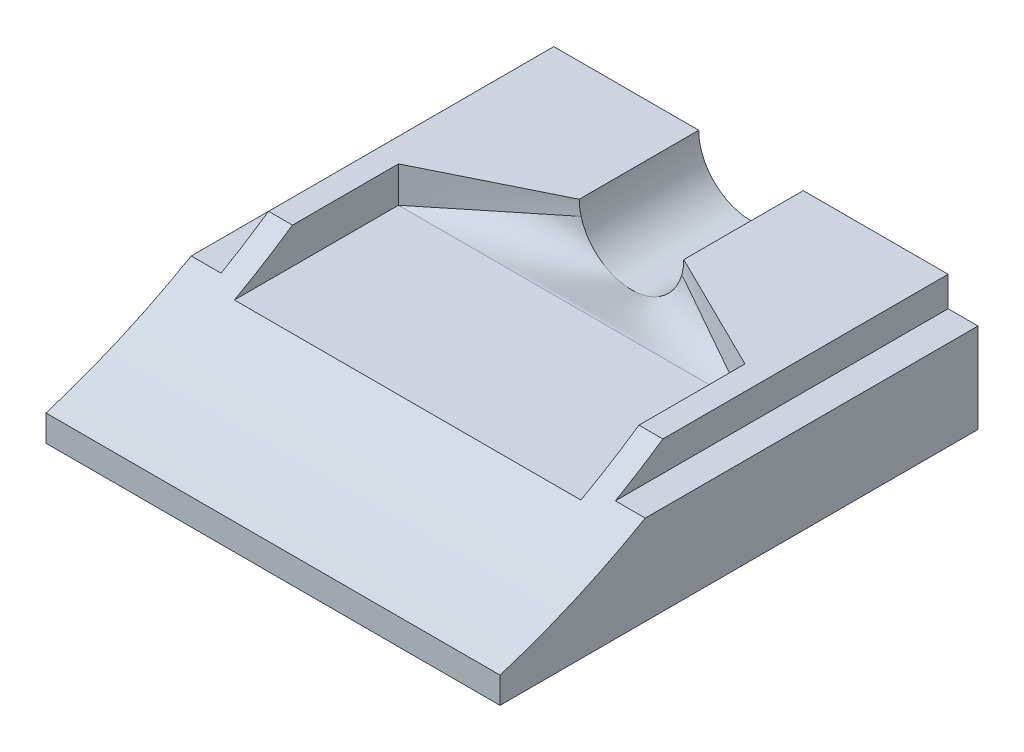
ISO-10303-21;
HEADER;
FILE_DESCRIPTION(('STEP AP214'),'2;1');
FILE_NAME('part.step','',(''),(''),'','','');
FILE_SCHEMA(('AUTOMOTIVE_DESIGN { 1 0 10303 214 1 1 1 1 }'));
ENDSEC;
DATA;
#1=APPLICATION_CONTEXT('core data for automotive mechanical design processes');
#2=APPLICATION_PROTOCOL_DEFINITION('international standard','automotive_design',2000,#1);
#3=PRODUCT_CONTEXT('',#1,'mechanical');
#4=PRODUCT('Part','Part','',(#3));
#5=PRODUCT_RELATED_PRODUCT_CATEGORY('part','',(#4));
#6=PRODUCT_DEFINITION_FORMATION('','',#4);
#7=PRODUCT_DEFINITION_CONTEXT('part definition',#1,'design');
#8=PRODUCT_DEFINITION('design','',#6,#7);
#9=PRODUCT_DEFINITION_SHAPE('','',#8);
#10=(LENGTH_UNIT() NAMED_UNIT(*) SI_UNIT(.MILLI.,.METRE.));
#11=(NAMED_UNIT(*) PLANE_ANGLE_UNIT() SI_UNIT($,.RADIAN.));
#12=(NAMED_UNIT(*) SI_UNIT($,.STERADIAN.) SOLID_ANGLE_UNIT());
#13=UNCERTAINTY_MEASURE_WITH_UNIT(LENGTH_MEASURE(1.E-05),#10,'distance_accuracy_value','');
#14=(GEOMETRIC_REPRESENTATION_CONTEXT(3) GLOBAL_UNCERTAINTY_ASSIGNED_CONTEXT((#13)) GLOBAL_UNIT_ASSIGNED_CONTEXT((#10,
#11,#12)) REPRESENTATION_CONTEXT('',''));
#15=CARTESIAN_POINT('',(0.,0.,0.));
#16=DIRECTION('',(0.,0.,1.));
#17=DIRECTION('',(1.,0.,0.));
#18=AXIS2_PLACEMENT_3D('',#15,#16,#17);
#19=CARTESIAN_POINT('',(-24.13,6.35,50.8));
#20=DIRECTION('',(0.,-1.,0.));
#21=DIRECTION('',(0.,0.,-1.));
#22=AXIS2_PLACEMENT_3D('',#19,#20,#21);
#23=PLANE('',#22);
#24=DIRECTION('',(0.,0.,1.));
#25=VECTOR('',#24,1.);
#26=CARTESIAN_POINT('',(18.415,6.35,19.05));
#27=LINE('',#26,#25);
#28=CARTESIAN_POINT('',(18.415,6.35,19.05));
#29=VERTEX_POINT('',#28);
#30=CARTESIAN_POINT('',(18.415,6.34999999999999,30.3182860225088));
#31=VERTEX_POINT('',#30);
#32=EDGE_CURVE('E292',#29,#31,#27,.T.);
#33=ORIENTED_EDGE('',*,*,#32,.T.);
#34=DIRECTION('',(-1.,0.,0.));
#35=VECTOR('',#34,1.);
#36=CARTESIAN_POINT('',(24.13,6.34999999999999,30.3182860225089));
#37=LINE('',#36,#35);
#38=CARTESIAN_POINT('',(20.955,6.34999999999999,30.3182860225089));
#39=VERTEX_POINT('',#38);
#40=EDGE_CURVE('E350',#31,#39,#37,.F.);
#41=ORIENTED_EDGE('',*,*,#40,.T.);
#42=DIRECTION('',(0.,0.,-1.));
#43=VECTOR('',#42,1.);
#44=CARTESIAN_POINT('',(20.955,6.35,50.8));
#45=LINE('',#44,#43);
#46=CARTESIAN_POINT('',(20.955,6.35,0.));
#47=VERTEX_POINT('',#46);
#48=EDGE_CURVE('E209',#39,#47,#45,.T.);
#49=ORIENTED_EDGE('',*,*,#48,.T.);
#50=DIRECTION('',(-1.,0.,0.));
#51=VECTOR('',#50,1.);
#52=CARTESIAN_POINT('',(-24.13,6.35,0.));
#53=LINE('',#52,#51);
#54=CARTESIAN_POINT('',(5.55625,6.35,0.));
#55=VERTEX_POINT('',#54);
#56=EDGE_CURVE('E228',#47,#55,#53,.T.);
#57=ORIENTED_EDGE('',*,*,#56,.T.);
#58=DIRECTION('',(0.,0.,-1.));
#59=VECTOR('',#58,1.);
#60=CARTESIAN_POINT('',(5.55625,6.35,12.7));
#61=LINE('',#60,#59);
#62=CARTESIAN_POINT('',(5.55625,6.35,12.7));
#63=VERTEX_POINT('',#62);
#64=EDGE_CURVE('E514',#63,#55,#61,.T.);
#65=ORIENTED_EDGE('',*,*,#64,.F.);
#66=CARTESIAN_POINT('',(18.415,6.35,19.05));
#67=CARTESIAN_POINT('',(14.12875,6.35,16.9333333333333));
#68=CARTESIAN_POINT('',(9.8425,6.35,14.8166666666667));
#69=CARTESIAN_POINT('',(5.55625,6.35,12.7));
#70=B_SPLINE_CURVE_WITH_KNOTS('',3,(#66,#67,#68,#69),.UNSPECIFIED.,.F.,.F.,(4,4),(0.,1.),.UNSPECIFIED.);
#71=EDGE_CURVE('E353',#63,#29,#70,.F.);
#72=ORIENTED_EDGE('',*,*,#71,.T.);
#73=EDGE_LOOP('',(#33,#41,#49,#57,#65,#72));
#74=FACE_BOUND('',#73,.T.);
#75=ADVANCED_FACE('F66',(#74),#23,.F.);
#76=DIRECTION('',(0.,0.,-1.));
#77=VECTOR('',#76,1.);
#78=CARTESIAN_POINT('',(-20.955,6.35,50.8));
#79=LINE('',#78,#77);
#80=CARTESIAN_POINT('',(-20.955,6.34999999999999,30.3182860225089));
#81=VERTEX_POINT('',#80);
#82=CARTESIAN_POINT('',(-20.955,6.35,0.));
#83=VERTEX_POINT('',#82);
#84=EDGE_CURVE('E535',#81,#83,#79,.T.);
#85=ORIENTED_EDGE('',*,*,#84,.F.);
#86=DIRECTION('',(-1.,0.,0.));
#87=VECTOR('',#86,1.);
#88=CARTESIAN_POINT('',(24.13,6.34999999999999,30.3182860225089));
#89=LINE('',#88,#87);
#90=CARTESIAN_POINT('',(-18.415,6.34999999999999,30.3182860225088));
#91=VERTEX_POINT('',#90);
#92=EDGE_CURVE('E363',#81,#91,#89,.F.);
#93=ORIENTED_EDGE('',*,*,#92,.T.);
#94=DIRECTION('',(0.,0.,1.));
#95=VECTOR('',#94,1.);
#96=CARTESIAN_POINT('',(-18.415,6.35,19.05));
#97=LINE('',#96,#95);
#98=CARTESIAN_POINT('',(-18.415,6.35,19.05));
#99=VERTEX_POINT('',#98);
#100=EDGE_CURVE('E300',#99,#91,#97,.T.);
#101=ORIENTED_EDGE('',*,*,#100,.F.);
#102=CARTESIAN_POINT('',(-5.55625,6.35,12.7));
#103=CARTESIAN_POINT('',(-9.8425,6.35,14.8166666666667));
#104=CARTESIAN_POINT('',(-14.12875,6.35,16.9333333333333));
#105=CARTESIAN_POINT('',(-18.415,6.35,19.05));
#106=B_SPLINE_CURVE_WITH_KNOTS('',3,(#102,#103,#104,#105),.UNSPECIFIED.,.F.,.F.,(4,4),(0.,1.),.UNSPECIFIED.);
#107=CARTESIAN_POINT('',(-5.55625,6.35,12.7));
#108=VERTEX_POINT('',#107);
#109=EDGE_CURVE('E474',#108,#99,#106,.T.);
#110=ORIENTED_EDGE('',*,*,#109,.F.);
#111=DIRECTION('',(0.,0.,-1.));
#112=VECTOR('',#111,1.);
#113=CARTESIAN_POINT('',(-5.55625,6.35,12.7));
#114=LINE('',#113,#112);
#115=CARTESIAN_POINT('',(-5.55625,6.35,0.));
#116=VERTEX_POINT('',#115);
#117=EDGE_CURVE('E227',#116,#108,#114,.F.);
#118=ORIENTED_EDGE('',*,*,#117,.F.);
#119=EDGE_CURVE('E226',#116,#83,#53,.T.);
#120=ORIENTED_EDGE('',*,*,#119,.T.);
#121=EDGE_LOOP('',(#85,#93,#101,#110,#118,#120));
#122=FACE_BOUND('',#121,.T.);
#123=ADVANCED_FACE('F270',(#122),#23,.F.);
#124=CARTESIAN_POINT('',(0.,0.,0.));
#125=DIRECTION('',(0.,0.,1.));
#126=DIRECTION('',(1.,0.,0.));
#127=AXIS2_PLACEMENT_3D('',#124,#125,#126);
#128=PLANE('',#127);
#129=DIRECTION('',(-1.,0.,0.));
#130=VECTOR('',#129,1.);
#131=CARTESIAN_POINT('',(-20.955,3.175,0.));
#132=LINE('',#131,#130);
#133=CARTESIAN_POINT('',(-20.955,3.175,0.));
#134=VERTEX_POINT('',#133);
#135=CARTESIAN_POINT('',(-24.13,3.175,0.));
#136=VERTEX_POINT('',#135);
#137=EDGE_CURVE('E540',#134,#136,#132,.T.);
#138=ORIENTED_EDGE('',*,*,#137,.F.);
#139=DIRECTION('',(0.,-1.,0.));
#140=VECTOR('',#139,1.);
#141=CARTESIAN_POINT('',(-20.955,6.35,0.));
#142=LINE('',#141,#140);
#143=EDGE_CURVE('E534',#83,#134,#142,.T.);
#144=ORIENTED_EDGE('',*,*,#143,.F.);
#145=ORIENTED_EDGE('',*,*,#119,.F.);
#146=CARTESIAN_POINT('',(0.,6.35,0.));
#147=DIRECTION('',(0.,0.,1.));
#148=DIRECTION('',(1.,0.,0.));
#149=AXIS2_PLACEMENT_3D('',#146,#147,#148);
#150=CIRCLE('',#149,5.55625);
#151=EDGE_CURVE('E74',#55,#116,#150,.F.);
#152=ORIENTED_EDGE('',*,*,#151,.F.);
#153=ORIENTED_EDGE('',*,*,#56,.F.);
#154=DIRECTION('',(0.,-1.,0.));
#155=VECTOR('',#154,1.);
#156=CARTESIAN_POINT('',(20.955,6.35,0.));
#157=LINE('',#156,#155);
#158=CARTESIAN_POINT('',(20.955,3.175,0.));
#159=VERTEX_POINT('',#158);
#160=EDGE_CURVE('E531',#47,#159,#157,.T.);
#161=ORIENTED_EDGE('',*,*,#160,.T.);
#162=DIRECTION('',(1.,0.,0.));
#163=VECTOR('',#162,1.);
#164=CARTESIAN_POINT('',(20.955,3.175,0.));
#165=LINE('',#164,#163);
#166=CARTESIAN_POINT('',(24.13,3.175,0.));
#167=VERTEX_POINT('',#166);
#168=EDGE_CURVE('E213',#159,#167,#165,.T.);
#169=ORIENTED_EDGE('',*,*,#168,.T.);
#170=DIRECTION('',(0.,1.,0.));
#171=VECTOR('',#170,1.);
#172=CARTESIAN_POINT('',(24.13,6.35,0.));
#173=LINE('',#172,#171);
#174=CARTESIAN_POINT('',(24.13,-6.35,0.));
#175=VERTEX_POINT('',#174);
#176=EDGE_CURVE('E208',#175,#167,#173,.T.);
#177=ORIENTED_EDGE('',*,*,#176,.F.);
#178=DIRECTION('',(1.,0.,0.));
#179=VECTOR('',#178,1.);
#180=CARTESIAN_POINT('',(-24.13,-6.35,0.));
#181=LINE('',#180,#179);
#182=CARTESIAN_POINT('',(-24.13,-6.35,0.));
#183=VERTEX_POINT('',#182);
#184=EDGE_CURVE('E220',#183,#175,#181,.T.);
#185=ORIENTED_EDGE('',*,*,#184,.F.);
#186=DIRECTION('',(0.,-1.,0.));
#187=VECTOR('',#186,1.);
#188=CARTESIAN_POINT('',(-24.13,6.35,0.));
#189=LINE('',#188,#187);
#190=EDGE_CURVE('E230',#136,#183,#189,.T.);
#191=ORIENTED_EDGE('',*,*,#190,.F.);
#192=EDGE_LOOP('',(#138,#144,#145,#152,#153,#161,#169,#177,#185,#191));
#193=FACE_BOUND('',#192,.T.);
#194=ADVANCED_FACE('F267',(#193),#128,.F.);
#195=CARTESIAN_POINT('',(24.13,6.35,50.8));
#196=DIRECTION('',(-1.,0.,0.));
#197=DIRECTION('',(0.,0.,1.));
#198=AXIS2_PLACEMENT_3D('',#195,#196,#197);
#199=PLANE('',#198);
#200=DIRECTION('',(0.,0.,-1.));
#201=VECTOR('',#200,1.);
#202=CARTESIAN_POINT('',(24.13,3.175,50.8));
#203=LINE('',#202,#201);
#204=CARTESIAN_POINT('',(24.13,3.175,35.366160829178));
#205=VERTEX_POINT('',#204);
#206=EDGE_CURVE('E200',#205,#167,#203,.T.);
#207=ORIENTED_EDGE('',*,*,#206,.F.);
#208=CARTESIAN_POINT('',(24.13,69.2150000000001,73.3813998788012));
#209=DIRECTION('',(-1.,0.,0.));
#210=DIRECTION('',(0.,0.,1.));
#211=AXIS2_PLACEMENT_3D('',#208,#209,#210);
#212=CIRCLE('',#211,76.2000000000001);
#213=CARTESIAN_POINT('',(24.13,-3.56219683742755,50.8));
#214=VERTEX_POINT('',#213);
#215=EDGE_CURVE('E183',#205,#214,#212,.T.);
#216=ORIENTED_EDGE('',*,*,#215,.T.);
#217=DIRECTION('',(0.,1.,0.));
#218=VECTOR('',#217,1.);
#219=CARTESIAN_POINT('',(24.13,6.35,50.8));
#220=LINE('',#219,#218);
#221=CARTESIAN_POINT('',(24.13,-6.35,50.8));
#222=VERTEX_POINT('',#221);
#223=EDGE_CURVE('E217',#222,#214,#220,.T.);
#224=ORIENTED_EDGE('',*,*,#223,.F.);
#225=DIRECTION('',(0.,0.,-1.));
#226=VECTOR('',#225,1.);
#227=CARTESIAN_POINT('',(24.13,-6.35,50.8));
#228=LINE('',#227,#226);
#229=EDGE_CURVE('E224',#222,#175,#228,.T.);
#230=ORIENTED_EDGE('',*,*,#229,.T.);
#231=ORIENTED_EDGE('',*,*,#176,.T.);
#232=EDGE_LOOP('',(#207,#216,#224,#230,#231));
#233=FACE_BOUND('',#232,.T.);
#234=ADVANCED_FACE('F68',(#233),#199,.F.);
#235=CARTESIAN_POINT('',(0.,0.,50.8));
#236=DIRECTION('',(0.,0.,1.));
#237=DIRECTION('',(1.,0.,0.));
#238=AXIS2_PLACEMENT_3D('',#235,#236,#237);
#239=PLANE('',#238);
#240=DIRECTION('',(-1.,0.,0.));
#241=VECTOR('',#240,1.);
#242=CARTESIAN_POINT('',(24.13,-3.56219683742753,50.8));
#243=LINE('',#242,#241);
#244=CARTESIAN_POINT('',(-24.13,-3.56219683742755,50.8));
#245=VERTEX_POINT('',#244);
#246=EDGE_CURVE('E189',#245,#214,#243,.F.);
#247=ORIENTED_EDGE('',*,*,#246,.F.);
#248=DIRECTION('',(0.,-1.,0.));
#249=VECTOR('',#248,1.);
#250=CARTESIAN_POINT('',(-24.13,6.35,50.8));
#251=LINE('',#250,#249);
#252=CARTESIAN_POINT('',(-24.13,-6.35,50.8));
#253=VERTEX_POINT('',#252);
#254=EDGE_CURVE('E219',#245,#253,#251,.T.);
#255=ORIENTED_EDGE('',*,*,#254,.T.);
#256=DIRECTION('',(1.,0.,0.));
#257=VECTOR('',#256,1.);
#258=CARTESIAN_POINT('',(-24.13,-6.35,50.8));
#259=LINE('',#258,#257);
#260=EDGE_CURVE('E222',#253,#222,#259,.T.);
#261=ORIENTED_EDGE('',*,*,#260,.T.);
#262=ORIENTED_EDGE('',*,*,#223,.T.);
#263=EDGE_LOOP('',(#247,#255,#261,#262));
#264=FACE_BOUND('',#263,.T.);
#265=ADVANCED_FACE('F262',(#264),#239,.T.);
#266=CARTESIAN_POINT('',(-24.13,6.35,50.8));
#267=DIRECTION('',(1.,0.,0.));
#268=DIRECTION('',(0.,0.,-1.));
#269=AXIS2_PLACEMENT_3D('',#266,#267,#268);
#270=PLANE('',#269);
#271=ORIENTED_EDGE('',*,*,#254,.F.);
#272=CARTESIAN_POINT('',(-24.13,69.2150000000001,73.3813998788012));
#273=DIRECTION('',(-1.,0.,0.));
#274=DIRECTION('',(0.,0.,1.));
#275=AXIS2_PLACEMENT_3D('',#272,#273,#274);
#276=CIRCLE('',#275,76.2000000000001);
#277=CARTESIAN_POINT('',(-24.13,3.175,35.366160829178));
#278=VERTEX_POINT('',#277);
#279=EDGE_CURVE('E194',#278,#245,#276,.T.);
#280=ORIENTED_EDGE('',*,*,#279,.F.);
#281=DIRECTION('',(0.,0.,-1.));
#282=VECTOR('',#281,1.);
#283=CARTESIAN_POINT('',(-24.13,3.175,50.8));
#284=LINE('',#283,#282);
#285=EDGE_CURVE('E88',#278,#136,#284,.T.);
#286=ORIENTED_EDGE('',*,*,#285,.T.);
#287=ORIENTED_EDGE('',*,*,#190,.T.);
#288=DIRECTION('',(0.,0.,-1.));
#289=VECTOR('',#288,1.);
#290=CARTESIAN_POINT('',(-24.13,-6.35,50.8));
#291=LINE('',#290,#289);
#292=EDGE_CURVE('E234',#253,#183,#291,.T.);
#293=ORIENTED_EDGE('',*,*,#292,.F.);
#294=EDGE_LOOP('',(#271,#280,#286,#287,#293));
#295=FACE_BOUND('',#294,.T.);
#296=ADVANCED_FACE('F265',(#295),#270,.F.);
#297=CARTESIAN_POINT('',(-24.13,-6.35,50.8));
#298=DIRECTION('',(0.,1.,0.));
#299=DIRECTION('',(0.,0.,1.));
#300=AXIS2_PLACEMENT_3D('',#297,#298,#299);
#301=PLANE('',#300);
#302=ORIENTED_EDGE('',*,*,#184,.T.);
#303=ORIENTED_EDGE('',*,*,#229,.F.);
#304=ORIENTED_EDGE('',*,*,#260,.F.);
#305=ORIENTED_EDGE('',*,*,#292,.T.);
#306=EDGE_LOOP('',(#302,#303,#304,#305));
#307=FACE_BOUND('',#306,.T.);
#308=ADVANCED_FACE('F260',(#307),#301,.F.);
#309=CARTESIAN_POINT('',(0.,6.35,12.7));
#310=DIRECTION('',(0.,0.,-1.));
#311=DIRECTION('',(-1.,0.,0.));
#312=AXIS2_PLACEMENT_3D('',#309,#310,#311);
#313=CYLINDRICAL_SURFACE('',#312,5.55625);
#314=ORIENTED_EDGE('',*,*,#117,.T.);
#315=CARTESIAN_POINT('',(-5.35601864474133,4.87183277682016,12.7));
#316=CARTESIAN_POINT('',(-5.37260366410709,4.93192729785584,12.7));
#317=CARTESIAN_POINT('',(-5.38817695319483,4.99230104112544,12.7));
#318=CARTESIAN_POINT('',(-5.41728349727584,5.11353822285822,12.7));
#319=CARTESIAN_POINT('',(-5.43081675463902,5.17440166075243,12.7));
#320=CARTESIAN_POINT('',(-5.45582661896698,5.29654922496364,12.7));
#321=CARTESIAN_POINT('',(-5.46730323931493,5.35783334854042,12.7));
#322=CARTESIAN_POINT('',(-5.48818810175741,5.48075299722203,12.7));
#323=CARTESIAN_POINT('',(-5.49759634479022,5.54238852216744,12.7));
#324=CARTESIAN_POINT('',(-5.51433277590191,5.66594171631692,12.7));
#325=CARTESIAN_POINT('',(-5.52166095135057,5.72785938723186,12.7));
#326=CARTESIAN_POINT('',(-5.5342300271045,5.85190643782034,12.7));
#327=CARTESIAN_POINT('',(-5.53947092028074,5.91403581821624,12.7));
#328=CARTESIAN_POINT('',(-5.54785817638951,6.03843575338189,12.7));
#329=CARTESIAN_POINT('',(-5.55100454073027,6.10070630805671,12.7));
#330=CARTESIAN_POINT('',(-5.55520045054686,6.22531790980704,12.7));
#331=CARTESIAN_POINT('',(-5.55624999978628,6.28765895675583,12.7));
#332=CARTESIAN_POINT('',(-5.55625,6.35,12.7));
#333=B_SPLINE_CURVE_WITH_KNOTS('',3,(#315,#316,#317,#318,#319,#320,#321,#322,#323,#324,#325,
#326,#327,#328,#329,#330,#331,#332),.UNSPECIFIED.,.F.,.F.,(4,2,2,2,2,2,2,2,4),(0.,
0.187014529944674,0.374028842630938,0.561041938313546,0.748054949161111,0.935069095531518,
1.12208388063585,1.30909854000274,1.49611286369624),.UNSPECIFIED.);
#334=CARTESIAN_POINT('',(-5.35639345933783,4.87172840631147,12.7));
#335=VERTEX_POINT('',#334);
#336=EDGE_CURVE('E211',#108,#335,#333,.F.);
#337=ORIENTED_EDGE('',*,*,#336,.T.);
#338=CARTESIAN_POINT('',(0.,6.35,12.7));
#339=DIRECTION('',(0.,0.,1.));
#340=DIRECTION('',(1.,0.,0.));
#341=AXIS2_PLACEMENT_3D('',#338,#339,#340);
#342=CIRCLE('',#341,5.55625);
#343=CARTESIAN_POINT('',(5.35635033199778,4.87174042441235,12.7));
#344=VERTEX_POINT('',#343);
#345=EDGE_CURVE('E383',#335,#344,#342,.T.);
#346=ORIENTED_EDGE('',*,*,#345,.T.);
#347=EDGE_CURVE('E385',#344,#63,#342,.T.);
#348=ORIENTED_EDGE('',*,*,#347,.T.);
#349=ORIENTED_EDGE('',*,*,#64,.T.);
#350=ORIENTED_EDGE('',*,*,#151,.T.);
#351=EDGE_LOOP('',(#314,#337,#346,#348,#349,#350));
#352=FACE_BOUND('',#351,.T.);
#353=ADVANCED_FACE('F249',(#352),#313,.F.);
#354=CARTESIAN_POINT('',(20.955,6.35,50.8));
#355=DIRECTION('',(1.,0.,0.));
#356=DIRECTION('',(0.,0.,-1.));
#357=AXIS2_PLACEMENT_3D('',#354,#355,#356);
#358=PLANE('',#357);
#359=CARTESIAN_POINT('',(20.955,69.2150000000001,73.3813998788012));
#360=DIRECTION('',(1.,0.,0.));
#361=DIRECTION('',(0.,0.,-1.));
#362=AXIS2_PLACEMENT_3D('',#359,#360,#361);
#363=CIRCLE('',#362,76.2000000000001);
#364=CARTESIAN_POINT('',(20.955,3.175,35.366160829178));
#365=VERTEX_POINT('',#364);
#366=EDGE_CURVE('E373',#365,#39,#363,.T.);
#367=ORIENTED_EDGE('',*,*,#366,.F.);
#368=DIRECTION('',(0.,0.,-1.));
#369=VECTOR('',#368,1.);
#370=CARTESIAN_POINT('',(20.955,3.175,50.8));
#371=LINE('',#370,#369);
#372=EDGE_CURVE('E202',#365,#159,#371,.T.);
#373=ORIENTED_EDGE('',*,*,#372,.T.);
#374=ORIENTED_EDGE('',*,*,#160,.F.);
#375=ORIENTED_EDGE('',*,*,#48,.F.);
#376=EDGE_LOOP('',(#367,#373,#374,#375));
#377=FACE_BOUND('',#376,.T.);
#378=ADVANCED_FACE('F259',(#377),#358,.T.);
#379=CARTESIAN_POINT('',(20.955,3.175,50.8));
#380=DIRECTION('',(0.,1.,0.));
#381=DIRECTION('',(0.,0.,1.));
#382=AXIS2_PLACEMENT_3D('',#379,#380,#381);
#383=PLANE('',#382);
#384=DIRECTION('',(-1.,0.,0.));
#385=VECTOR('',#384,1.);
#386=CARTESIAN_POINT('',(24.13,3.175,35.366160829178));
#387=LINE('',#386,#385);
#388=EDGE_CURVE('E186',#205,#365,#387,.T.);
#389=ORIENTED_EDGE('',*,*,#388,.F.);
#390=ORIENTED_EDGE('',*,*,#206,.T.);
#391=ORIENTED_EDGE('',*,*,#168,.F.);
#392=ORIENTED_EDGE('',*,*,#372,.F.);
#393=EDGE_LOOP('',(#389,#390,#391,#392));
#394=FACE_BOUND('',#393,.T.);
#395=ADVANCED_FACE('F198',(#394),#383,.T.);
#396=CARTESIAN_POINT('',(-20.955,6.35,50.8));
#397=DIRECTION('',(1.,0.,0.));
#398=DIRECTION('',(0.,0.,-1.));
#399=AXIS2_PLACEMENT_3D('',#396,#397,#398);
#400=PLANE('',#399);
#401=DIRECTION('',(0.,0.,-1.));
#402=VECTOR('',#401,1.);
#403=CARTESIAN_POINT('',(-20.955,3.175,50.8));
#404=LINE('',#403,#402);
#405=CARTESIAN_POINT('',(-20.955,3.175,35.366160829178));
#406=VERTEX_POINT('',#405);
#407=EDGE_CURVE('E537',#406,#134,#404,.T.);
#408=ORIENTED_EDGE('',*,*,#407,.F.);
#409=CARTESIAN_POINT('',(-20.955,69.2150000000001,73.3813998788012));
#410=DIRECTION('',(1.,0.,0.));
#411=DIRECTION('',(0.,0.,-1.));
#412=AXIS2_PLACEMENT_3D('',#409,#410,#411);
#413=CIRCLE('',#412,76.2000000000001);
#414=EDGE_CURVE('E370',#406,#81,#413,.T.);
#415=ORIENTED_EDGE('',*,*,#414,.T.);
#416=ORIENTED_EDGE('',*,*,#84,.T.);
#417=ORIENTED_EDGE('',*,*,#143,.T.);
#418=EDGE_LOOP('',(#408,#415,#416,#417));
#419=FACE_BOUND('',#418,.T.);
#420=ADVANCED_FACE('F333',(#419),#400,.F.);
#421=CARTESIAN_POINT('',(-20.955,3.175,50.8));
#422=DIRECTION('',(0.,-1.,0.));
#423=DIRECTION('',(0.,0.,-1.));
#424=AXIS2_PLACEMENT_3D('',#421,#422,#423);
#425=PLANE('',#424);
#426=ORIENTED_EDGE('',*,*,#285,.F.);
#427=DIRECTION('',(-1.,0.,0.));
#428=VECTOR('',#427,1.);
#429=CARTESIAN_POINT('',(24.13,3.175,35.366160829178));
#430=LINE('',#429,#428);
#431=EDGE_CURVE('E203',#278,#406,#430,.F.);
#432=ORIENTED_EDGE('',*,*,#431,.T.);
#433=ORIENTED_EDGE('',*,*,#407,.T.);
#434=ORIENTED_EDGE('',*,*,#137,.T.);
#435=EDGE_LOOP('',(#426,#432,#433,#434));
#436=FACE_BOUND('',#435,.T.);
#437=ADVANCED_FACE('F329',(#436),#425,.F.);
#438=CARTESIAN_POINT('',(-18.415,6.35,19.05));
#439=DIRECTION('',(-1.,0.,0.));
#440=DIRECTION('',(0.,-1.,0.));
#441=AXIS2_PLACEMENT_3D('',#438,#439,#440);
#442=PLANE('',#441);
#443=ORIENTED_EDGE('',*,*,#100,.T.);
#444=CARTESIAN_POINT('',(-18.4150000000001,69.2150000000001,73.3813998788012));
#445=DIRECTION('',(-1.,0.,0.));
#446=DIRECTION('',(0.,-1.,0.));
#447=AXIS2_PLACEMENT_3D('',#444,#445,#446);
#448=CIRCLE('',#447,76.2000000000001);
#449=CARTESIAN_POINT('',(-18.415,2.54,36.4912335061756));
#450=VERTEX_POINT('',#449);
#451=EDGE_CURVE('E360',#91,#450,#448,.T.);
#452=ORIENTED_EDGE('',*,*,#451,.T.);
#453=DIRECTION('',(0.,0.,1.));
#454=VECTOR('',#453,1.);
#455=CARTESIAN_POINT('',(-18.415,2.54,19.05));
#456=LINE('',#455,#454);
#457=CARTESIAN_POINT('',(-18.415,2.54,19.05));
#458=VERTEX_POINT('',#457);
#459=EDGE_CURVE('E316',#458,#450,#456,.T.);
#460=ORIENTED_EDGE('',*,*,#459,.F.);
#461=CARTESIAN_POINT('',(-18.415,6.35,19.05));
#462=CARTESIAN_POINT('',(-18.415,6.0325,19.05));
#463=CARTESIAN_POINT('',(-18.415,5.3975,19.05));
#464=CARTESIAN_POINT('',(-18.415,4.445,19.05));
#465=CARTESIAN_POINT('',(-18.415,3.4925,19.05));
#466=CARTESIAN_POINT('',(-18.415,2.8575,19.05));
#467=CARTESIAN_POINT('',(-18.415,2.54,19.05));
#468=B_SPLINE_CURVE_WITH_KNOTS('',3,(#461,#462,#463,#464,#465,#466,#467),.UNSPECIFIED.,.F.,.F.,
(4,1,1,1,4),(0.,0.0214285714285714,0.0428571428571429,0.0642857142857143,0.0857142857142857),.UNSPECIFIED.);
#469=EDGE_CURVE('E310',#99,#458,#468,.T.);
#470=ORIENTED_EDGE('',*,*,#469,.F.);
#471=EDGE_LOOP('',(#443,#452,#460,#470));
#472=FACE_BOUND('',#471,.T.);
#473=ADVANCED_FACE('F318',(#472),#442,.F.);
#474=CARTESIAN_POINT('',(18.415,2.54,19.05));
#475=DIRECTION('',(1.,0.,0.));
#476=DIRECTION('',(0.,1.,0.));
#477=AXIS2_PLACEMENT_3D('',#474,#475,#476);
#478=PLANE('',#477);
#479=DIRECTION('',(0.,0.,1.));
#480=VECTOR('',#479,1.);
#481=CARTESIAN_POINT('',(18.415,2.54,19.05));
#482=LINE('',#481,#480);
#483=CARTESIAN_POINT('',(18.415,2.54,19.05));
#484=VERTEX_POINT('',#483);
#485=CARTESIAN_POINT('',(18.415,2.54,36.4912335061756));
#486=VERTEX_POINT('',#485);
#487=EDGE_CURVE('E301',#484,#486,#482,.T.);
#488=ORIENTED_EDGE('',*,*,#487,.T.);
#489=CARTESIAN_POINT('',(18.4150000000001,69.2150000000001,73.3813998788012));
#490=DIRECTION('',(1.,0.,0.));
#491=DIRECTION('',(0.,1.,0.));
#492=AXIS2_PLACEMENT_3D('',#489,#490,#491);
#493=CIRCLE('',#492,76.2000000000001);
#494=EDGE_CURVE('E81',#486,#31,#493,.T.);
#495=ORIENTED_EDGE('',*,*,#494,.T.);
#496=ORIENTED_EDGE('',*,*,#32,.F.);
#497=CARTESIAN_POINT('',(18.415,2.54,19.05));
#498=CARTESIAN_POINT('',(18.415,2.8575,19.05));
#499=CARTESIAN_POINT('',(18.415,3.49249999999999,19.05));
#500=CARTESIAN_POINT('',(18.415,4.44500000000001,19.05));
#501=CARTESIAN_POINT('',(18.415,5.39749999999999,19.05));
#502=CARTESIAN_POINT('',(18.415,6.0325,19.05));
#503=CARTESIAN_POINT('',(18.415,6.35,19.05));
#504=B_SPLINE_CURVE_WITH_KNOTS('',3,(#497,#498,#499,#500,#501,#502,#503),.UNSPECIFIED.,.F.,.F.,
(4,1,1,1,4),(0.914285714285714,0.935714285714286,0.957142857142857,0.978571428571429,1.),.UNSPECIFIED.);
#505=EDGE_CURVE('E357',#484,#29,#504,.T.);
#506=ORIENTED_EDGE('',*,*,#505,.F.);
#507=EDGE_LOOP('',(#488,#495,#496,#506));
#508=FACE_BOUND('',#507,.T.);
#509=ADVANCED_FACE('F328',(#508),#478,.F.);
#510=CARTESIAN_POINT('',(-18.415,2.54,19.05));
#511=DIRECTION('',(0.,-1.,0.));
#512=DIRECTION('',(0.,0.,-1.));
#513=AXIS2_PLACEMENT_3D('',#510,#511,#512);
#514=PLANE('',#513);
#515=ORIENTED_EDGE('',*,*,#459,.T.);
#516=DIRECTION('',(-1.,0.,0.));
#517=VECTOR('',#516,1.);
#518=CARTESIAN_POINT('',(24.13,2.54,36.4912335061756));
#519=LINE('',#518,#517);
#520=EDGE_CURVE('E13',#450,#486,#519,.F.);
#521=ORIENTED_EDGE('',*,*,#520,.T.);
#522=ORIENTED_EDGE('',*,*,#487,.F.);
#523=CARTESIAN_POINT('',(-18.415,2.54,19.05));
#524=CARTESIAN_POINT('',(-16.8804166666667,2.54,19.05));
#525=CARTESIAN_POINT('',(-13.81125,2.54,19.05));
#526=CARTESIAN_POINT('',(-9.2075,2.54,19.05));
#527=CARTESIAN_POINT('',(-4.60375,2.54,19.05));
#528=CARTESIAN_POINT('',(0.,2.54,19.05));
#529=CARTESIAN_POINT('',(4.60375,2.54,19.05));
#530=CARTESIAN_POINT('',(9.2075,2.54,19.05));
#531=CARTESIAN_POINT('',(13.81125,2.54,19.05));
#532=CARTESIAN_POINT('',(16.8804166666667,2.54,19.05));
#533=CARTESIAN_POINT('',(18.415,2.54,19.05));
#534=B_SPLINE_CURVE_WITH_KNOTS('',3,(#523,#524,#525,#526,#527,#528,#529,#530,#531,#532,#533),
.UNSPECIFIED.,.F.,.F.,(4,1,1,1,1,1,1,1,4),(0.0857142857142857,0.189285714285714,
0.292857142857143,0.396428571428572,0.5,0.603571428571429,0.707142857142857,0.810714285714286,
0.914285714285714),.UNSPECIFIED.);
#535=CARTESIAN_POINT('',(11.5341450872156,2.54,19.05));
#536=VERTEX_POINT('',#535);
#537=EDGE_CURVE('E556',#536,#484,#534,.T.);
#538=ORIENTED_EDGE('',*,*,#537,.F.);
#539=CARTESIAN_POINT('',(-18.415,2.54,19.05));
#540=CARTESIAN_POINT('',(-16.8804166666667,2.54,19.05));
#541=CARTESIAN_POINT('',(-13.81125,2.54,19.05));
#542=CARTESIAN_POINT('',(-9.2075,2.54,19.05));
#543=CARTESIAN_POINT('',(-4.60375,2.54,19.05));
#544=CARTESIAN_POINT('',(0.,2.54,19.05));
#545=CARTESIAN_POINT('',(4.60375,2.54,19.05));
#546=CARTESIAN_POINT('',(9.2075,2.54,19.05));
#547=CARTESIAN_POINT('',(13.81125,2.54,19.05));
#548=CARTESIAN_POINT('',(16.8804166666667,2.54,19.05));
#549=CARTESIAN_POINT('',(18.415,2.54,19.05));
#550=B_SPLINE_CURVE_WITH_KNOTS('',3,(#539,#540,#541,#542,#543,#544,#545,#546,#547,#548,#549),
.UNSPECIFIED.,.F.,.F.,(4,1,1,1,1,1,1,1,4),(0.0857142857142857,0.189285714285714,
0.292857142857143,0.396428571428572,0.5,0.603571428571429,0.707142857142857,0.810714285714286,
0.914285714285714),.UNSPECIFIED.);
#551=CARTESIAN_POINT('',(-11.5341450872156,2.54,19.05));
#552=VERTEX_POINT('',#551);
#553=EDGE_CURVE('E458',#552,#536,#550,.T.);
#554=ORIENTED_EDGE('',*,*,#553,.F.);
#555=CARTESIAN_POINT('',(-18.415,2.54,19.05));
#556=CARTESIAN_POINT('',(-16.8804166666667,2.54,19.05));
#557=CARTESIAN_POINT('',(-13.81125,2.54,19.05));
#558=CARTESIAN_POINT('',(-9.2075,2.54,19.05));
#559=CARTESIAN_POINT('',(-4.60375,2.54,19.05));
#560=CARTESIAN_POINT('',(0.,2.54,19.05));
#561=CARTESIAN_POINT('',(4.60375,2.54,19.05));
#562=CARTESIAN_POINT('',(9.2075,2.54,19.05));
#563=CARTESIAN_POINT('',(13.81125,2.54,19.05));
#564=CARTESIAN_POINT('',(16.8804166666667,2.54,19.05));
#565=CARTESIAN_POINT('',(18.415,2.54,19.05));
#566=B_SPLINE_CURVE_WITH_KNOTS('',3,(#555,#556,#557,#558,#559,#560,#561,#562,#563,#564,#565),
.UNSPECIFIED.,.F.,.F.,(4,1,1,1,1,1,1,1,4),(0.0857142857142857,0.189285714285714,
0.292857142857143,0.396428571428572,0.5,0.603571428571429,0.707142857142857,0.810714285714286,
0.914285714285714),.UNSPECIFIED.);
#567=EDGE_CURVE('E553',#458,#552,#566,.T.);
#568=ORIENTED_EDGE('',*,*,#567,.F.);
#569=EDGE_LOOP('',(#515,#521,#522,#538,#554,#568));
#570=FACE_BOUND('',#569,.T.);
#571=ADVANCED_FACE('F330',(#570),#514,.F.);
#572=CARTESIAN_POINT('',(5.35601864474134,4.87183277682016,12.7));
#573=CARTESIAN_POINT('',(9.70901242982756,4.09455518454677,14.8166666666667));
#574=CARTESIAN_POINT('',(14.0620062149138,3.31727759227339,16.9333333333333));
#575=CARTESIAN_POINT('',(18.415,2.54,19.05));
#576=CARTESIAN_POINT('',(5.38918863957491,4.9920215538331,12.7));
#577=CARTESIAN_POINT('',(9.73112575971661,4.28051436922206,14.8166666666667));
#578=CARTESIAN_POINT('',(14.0730628798583,3.56900718461103,16.9333333333333));
#579=CARTESIAN_POINT('',(18.415,2.8575,19.05));
#580=CARTESIAN_POINT('',(5.44743498444064,5.23463341009776,12.7));
#581=CARTESIAN_POINT('',(9.76995665629376,4.6539222733985,14.8166666666667));
#582=CARTESIAN_POINT('',(14.0924783281469,4.07321113669925,16.9333333333333));
#583=CARTESIAN_POINT('',(18.415,3.49249999999999,19.05));
#584=CARTESIAN_POINT('',(5.51012530557085,5.60360536168845,12.7));
#585=CARTESIAN_POINT('',(9.81175020371391,5.21740357445897,14.8166666666667));
#586=CARTESIAN_POINT('',(14.113375101857,4.83120178722949,16.9333333333333));
#587=CARTESIAN_POINT('',(18.415,4.44500000000001,19.05));
#588=CARTESIAN_POINT('',(5.54785339053752,5.97595235940166,12.7));
#589=CARTESIAN_POINT('',(9.83690226035834,5.78313490626777,14.8166666666667));
#590=CARTESIAN_POINT('',(14.1259511301792,5.59031745313388,16.9333333333333));
#591=CARTESIAN_POINT('',(18.415,5.39749999999999,19.05));
#592=CARTESIAN_POINT('',(5.55625,6.22531804189409,12.7));
#593=CARTESIAN_POINT('',(9.8425,6.16104536126273,14.8166666666667));
#594=CARTESIAN_POINT('',(14.12875,6.09677268063136,16.9333333333333));
#595=CARTESIAN_POINT('',(18.415,6.0325,19.05));
#596=CARTESIAN_POINT('',(5.55625,6.35,12.7));
#597=CARTESIAN_POINT('',(9.8425,6.35,14.8166666666667));
#598=CARTESIAN_POINT('',(14.12875,6.35,16.9333333333333));
#599=CARTESIAN_POINT('',(18.415,6.35,19.05));
#600=B_SPLINE_SURFACE_WITH_KNOTS('',3,3,((#572,#573,#574,#575),(#576,#577,#578,#579),(#580,#581,
#582,#583),(#584,#585,#586,#587),(#588,#589,#590,#591),(#592,#593,#594,#595),(#596,#597,#598,
#599)),.UNSPECIFIED.,.F.,.F.,.F.,(4,1,1,1,4),(4,4),(0.914285714285714,0.935714285714286,
0.957142857142857,0.978571428571429,1.),(0.,1.),.UNSPECIFIED.);
#601=DIRECTION('',(0.887941012904579,-0.158552179641486,0.431766098637821));
#602=VECTOR('',#601,1.);
#603=CARTESIAN_POINT('',(11.8855093223707,3.70591638841008,15.875));
#604=LINE('',#603,#602);
#605=EDGE_CURVE('E466',#344,#484,#604,.T.);
#606=ORIENTED_EDGE('',*,*,#347,.F.);
#607=ORIENTED_EDGE('',*,*,#605,.T.);
#608=ORIENTED_EDGE('',*,*,#505,.T.);
#609=ORIENTED_EDGE('',*,*,#71,.F.);
#610=EDGE_LOOP('',(#606,#607,#608,#609));
#611=FACE_BOUND('',#610,.T.);
#612=ADVANCED_FACE('F399',(#611),#600,.F.);
#613=CARTESIAN_POINT('',(-5.35601864474133,4.87183277682016,12.7));
#614=CARTESIAN_POINT('',(-9.70901242982755,4.09455518454678,14.8166666666667));
#615=CARTESIAN_POINT('',(-14.0620062149138,3.31727759227339,16.9333333333333));
#616=CARTESIAN_POINT('',(-18.415,2.54,19.05));
#617=CARTESIAN_POINT('',(-5.19569700382723,4.29092035742268,12.7));
#618=CARTESIAN_POINT('',(-9.09060355810704,3.70728023828178,14.8166666666667));
#619=CARTESIAN_POINT('',(-12.9855101123869,3.12364011914089,16.9333333333333));
#620=CARTESIAN_POINT('',(-16.8804166666667,2.54,19.05));
#621=CARTESIAN_POINT('',(-4.68453305083371,3.18177336599491,12.7));
#622=CARTESIAN_POINT('',(-7.72677203388914,2.96784891066327,14.8166666666667));
#623=CARTESIAN_POINT('',(-10.7690110169446,2.75392445533164,16.9333333333333));
#624=CARTESIAN_POINT('',(-13.81125,2.54,19.05));
#625=CARTESIAN_POINT('',(-3.42586460882338,1.85055059350645,12.7));
#626=CARTESIAN_POINT('',(-5.35307640588225,2.08036706233763,14.8166666666666));
#627=CARTESIAN_POINT('',(-7.28028820294112,2.31018353116882,16.9333333333333));
#628=CARTESIAN_POINT('',(-9.2075,2.54,19.05));
#629=CARTESIAN_POINT('',(-1.80782135590895,0.991482698464812,12.7));
#630=CARTESIAN_POINT('',(-2.73979757060596,1.50765513230988,14.8166666666667));
#631=CARTESIAN_POINT('',(-3.67177378530298,2.02382756615494,16.9333333333333));
#632=CARTESIAN_POINT('',(-4.60375,2.54,19.05));
#633=CARTESIAN_POINT('',(0.,0.694751254482748,12.7));
#634=CARTESIAN_POINT('',(0.,1.30983416965517,14.8166666666667));
#635=CARTESIAN_POINT('',(0.,1.92491708482758,16.9333333333333));
#636=CARTESIAN_POINT('',(0.,2.54,19.05));
#637=CARTESIAN_POINT('',(1.80782135590895,0.991482698464813,12.7));
#638=CARTESIAN_POINT('',(2.73979757060597,1.50765513230988,14.8166666666667));
#639=CARTESIAN_POINT('',(3.67177378530298,2.02382756615494,16.9333333333333));
#640=CARTESIAN_POINT('',(4.60375,2.54,19.05));
#641=CARTESIAN_POINT('',(3.42586460882337,1.85055059350644,12.7));
#642=CARTESIAN_POINT('',(5.35307640588225,2.08036706233762,14.8166666666667));
#643=CARTESIAN_POINT('',(7.28028820294113,2.31018353116881,16.9333333333333));
#644=CARTESIAN_POINT('',(9.2075,2.54,19.05));
#645=CARTESIAN_POINT('',(4.68453305083372,3.1817733659949,12.7));
#646=CARTESIAN_POINT('',(7.72677203388915,2.96784891066327,14.8166666666667));
#647=CARTESIAN_POINT('',(10.7690110169446,2.75392445533164,16.9333333333333));
#648=CARTESIAN_POINT('',(13.81125,2.54,19.05));
#649=CARTESIAN_POINT('',(5.19569700382723,4.29092035742267,12.7));
#650=CARTESIAN_POINT('',(9.09060355810704,3.70728023828178,14.8166666666667));
#651=CARTESIAN_POINT('',(12.9855101123869,3.12364011914089,16.9333333333333));
#652=CARTESIAN_POINT('',(16.8804166666667,2.54,19.05));
#653=CARTESIAN_POINT('',(5.35601864474134,4.87183277682016,12.7));
#654=CARTESIAN_POINT('',(9.70901242982756,4.09455518454677,14.8166666666667));
#655=CARTESIAN_POINT('',(14.0620062149138,3.31727759227339,16.9333333333333));
#656=CARTESIAN_POINT('',(18.415,2.54,19.05));
#657=B_SPLINE_SURFACE_WITH_KNOTS('',3,3,((#613,#614,#615,#616),(#617,#618,#619,#620),(#621,#622,
#623,#624),(#625,#626,#627,#628),(#629,#630,#631,#632),(#633,#634,#635,#636),(#637,#638,#639,
#640),(#641,#642,#643,#644),(#645,#646,#647,#648),(#649,#650,#651,#652),(#653,#654,#655,#656)),
.UNSPECIFIED.,.F.,.F.,.F.,(4,1,1,1,1,1,1,1,4),(4,4),(0.0857142857142857,0.189285714285714,
0.292857142857143,0.396428571428572,0.5,0.603571428571429,0.707142857142857,0.810714285714286,
0.914285714285714),(0.,1.),.UNSPECIFIED.);
#658=DIRECTION('',(-0.887941012904579,-0.158552179641486,0.431766098637821));
#659=VECTOR('',#658,1.);
#660=CARTESIAN_POINT('',(-11.8855093223707,3.70591638841008,15.875));
#661=LINE('',#660,#659);
#662=EDGE_CURVE('E378',#335,#458,#661,.T.);
#663=ORIENTED_EDGE('',*,*,#345,.F.);
#664=ORIENTED_EDGE('',*,*,#662,.T.);
#665=ORIENTED_EDGE('',*,*,#567,.T.);
#666=ORIENTED_EDGE('',*,*,#553,.T.);
#667=ORIENTED_EDGE('',*,*,#537,.T.);
#668=ORIENTED_EDGE('',*,*,#605,.F.);
#669=EDGE_LOOP('',(#663,#664,#665,#666,#667,#668));
#670=FACE_BOUND('',#669,.T.);
#671=ADVANCED_FACE('F405',(#670),#657,.F.);
#672=CARTESIAN_POINT('',(-5.55625,6.35,12.7));
#673=CARTESIAN_POINT('',(-9.8425,6.35,14.8166666666667));
#674=CARTESIAN_POINT('',(-14.12875,6.35,16.9333333333333));
#675=CARTESIAN_POINT('',(-18.415,6.35,19.05));
#676=CARTESIAN_POINT('',(-5.55625,6.22531804189409,12.7));
#677=CARTESIAN_POINT('',(-9.8425,6.16104536126273,14.8166666666667));
#678=CARTESIAN_POINT('',(-14.12875,6.09677268063136,16.9333333333333));
#679=CARTESIAN_POINT('',(-18.415,6.0325,19.05));
#680=CARTESIAN_POINT('',(-5.54785362028412,5.97595354903661,12.7));
#681=CARTESIAN_POINT('',(-9.83690241352276,5.78313569935774,14.8166666666667));
#682=CARTESIAN_POINT('',(-14.1259512067614,5.59031784967887,16.9333333333333));
#683=CARTESIAN_POINT('',(-18.415,5.3975,19.05));
#684=CARTESIAN_POINT('',(-5.51012462747496,5.60360035578366,12.7));
#685=CARTESIAN_POINT('',(-9.81174975164997,5.21740023718911,14.8166666666667));
#686=CARTESIAN_POINT('',(-14.113374875825,4.83120011859455,16.9333333333333));
#687=CARTESIAN_POINT('',(-18.415,4.445,19.05));
#688=CARTESIAN_POINT('',(-5.44743507946018,5.23463461798272,12.7));
#689=CARTESIAN_POINT('',(-9.76995671964013,4.65392307865515,14.8166666666667));
#690=CARTESIAN_POINT('',(-14.0924783598201,4.07321153932758,16.9333333333333));
#691=CARTESIAN_POINT('',(-18.415,3.4925,19.05));
#692=CARTESIAN_POINT('',(-5.38918863957491,4.9920215538331,12.7));
#693=CARTESIAN_POINT('',(-9.7311257597166,4.28051436922207,14.8166666666667));
#694=CARTESIAN_POINT('',(-14.0730628798583,3.56900718461103,16.9333333333333));
#695=CARTESIAN_POINT('',(-18.415,2.8575,19.05));
#696=CARTESIAN_POINT('',(-5.35601864474133,4.87183277682016,12.7));
#697=CARTESIAN_POINT('',(-9.70901242982755,4.09455518454678,14.8166666666667));
#698=CARTESIAN_POINT('',(-14.0620062149138,3.31727759227339,16.9333333333333));
#699=CARTESIAN_POINT('',(-18.415,2.54,19.05));
#700=B_SPLINE_SURFACE_WITH_KNOTS('',3,3,((#672,#673,#674,#675),(#676,#677,#678,#679),(#680,#681,
#682,#683),(#684,#685,#686,#687),(#688,#689,#690,#691),(#692,#693,#694,#695),(#696,#697,#698,
#699)),.UNSPECIFIED.,.F.,.F.,.F.,(4,1,1,1,4),(4,4),(0.,0.0214285714285714,0.0428571428571429,
0.0642857142857143,0.0857142857142857),(0.,1.),.UNSPECIFIED.);
#701=ORIENTED_EDGE('',*,*,#336,.F.);
#702=ORIENTED_EDGE('',*,*,#109,.T.);
#703=ORIENTED_EDGE('',*,*,#469,.T.);
#704=ORIENTED_EDGE('',*,*,#662,.F.);
#705=EDGE_LOOP('',(#701,#702,#703,#704));
#706=FACE_BOUND('',#705,.T.);
#707=ADVANCED_FACE('F487',(#706),#700,.F.);
#708=CARTESIAN_POINT('',(24.13,69.2150000000001,73.3813998788012));
#709=DIRECTION('',(-1.,0.,0.));
#710=DIRECTION('',(0.,0.,1.));
#711=AXIS2_PLACEMENT_3D('',#708,#709,#710);
#712=CYLINDRICAL_SURFACE('',#711,76.2000000000001);
#713=ORIENTED_EDGE('',*,*,#246,.T.);
#714=ORIENTED_EDGE('',*,*,#215,.F.);
#715=ORIENTED_EDGE('',*,*,#388,.T.);
#716=ORIENTED_EDGE('',*,*,#366,.T.);
#717=ORIENTED_EDGE('',*,*,#40,.F.);
#718=ORIENTED_EDGE('',*,*,#494,.F.);
#719=ORIENTED_EDGE('',*,*,#520,.F.);
#720=ORIENTED_EDGE('',*,*,#451,.F.);
#721=ORIENTED_EDGE('',*,*,#92,.F.);
#722=ORIENTED_EDGE('',*,*,#414,.F.);
#723=ORIENTED_EDGE('',*,*,#431,.F.);
#724=ORIENTED_EDGE('',*,*,#279,.T.);
#725=EDGE_LOOP('',(#713,#714,#715,#716,#717,#718,#719,#720,#721,#722,#723,#724));
#726=FACE_BOUND('',#725,.T.);
#727=ADVANCED_FACE('F185',(#726),#712,.F.);
#728=CLOSED_SHELL('',(#75,#123,#194,#234,#265,#296,#308,#353,#378,#395,#420,#437,#473,#509,#571,
#612,#671,#707,#727));
#729=MANIFOLD_SOLID_BREP('B2',#728);
#730=ADVANCED_BREP_SHAPE_REPRESENTATION('',(#18,#729),#14);
#731=SHAPE_DEFINITION_REPRESENTATION(#9,#730);
ENDSEC;
END-ISO-10303-21;
